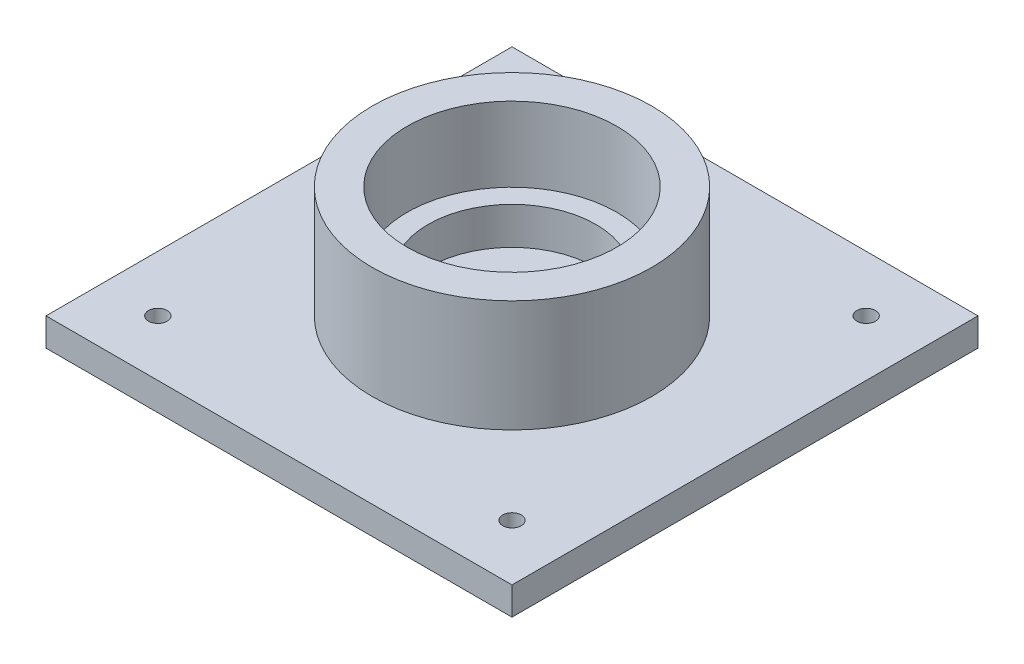
ISO-10303-21;
HEADER;
FILE_DESCRIPTION(('STEP AP214'),'2;1');
FILE_NAME('part.step','',(''),(''),'','','');
FILE_SCHEMA(('AUTOMOTIVE_DESIGN { 1 0 10303 214 1 1 1 1 }'));
ENDSEC;
DATA;
#1=APPLICATION_CONTEXT('core data for automotive mechanical design processes');
#2=APPLICATION_PROTOCOL_DEFINITION('international standard','automotive_design',2000,#1);
#3=PRODUCT_CONTEXT('',#1,'mechanical');
#4=PRODUCT('Part','Part','',(#3));
#5=PRODUCT_RELATED_PRODUCT_CATEGORY('part','',(#4));
#6=PRODUCT_DEFINITION_FORMATION('','',#4);
#7=PRODUCT_DEFINITION_CONTEXT('part definition',#1,'design');
#8=PRODUCT_DEFINITION('design','',#6,#7);
#9=PRODUCT_DEFINITION_SHAPE('','',#8);
#10=(LENGTH_UNIT() NAMED_UNIT(*) SI_UNIT(.MILLI.,.METRE.));
#11=(NAMED_UNIT(*) PLANE_ANGLE_UNIT() SI_UNIT($,.RADIAN.));
#12=(NAMED_UNIT(*) SI_UNIT($,.STERADIAN.) SOLID_ANGLE_UNIT());
#13=UNCERTAINTY_MEASURE_WITH_UNIT(LENGTH_MEASURE(1.E-05),#10,'distance_accuracy_value','');
#14=(GEOMETRIC_REPRESENTATION_CONTEXT(3) GLOBAL_UNCERTAINTY_ASSIGNED_CONTEXT((#13)) GLOBAL_UNIT_ASSIGNED_CONTEXT((#10,
#11,#12)) REPRESENTATION_CONTEXT('',''));
#15=CARTESIAN_POINT('',(0.,0.,0.));
#16=DIRECTION('',(0.,0.,1.));
#17=DIRECTION('',(1.,0.,0.));
#18=AXIS2_PLACEMENT_3D('',#15,#16,#17);
#19=CARTESIAN_POINT('',(0.,15.,0.));
#20=DIRECTION('',(0.,1.,0.));
#21=DIRECTION('',(0.,0.,1.));
#22=AXIS2_PLACEMENT_3D('',#19,#20,#21);
#23=PLANE('',#22);
#24=CARTESIAN_POINT('',(0.,15.,0.));
#25=DIRECTION('',(0.,1.,0.));
#26=DIRECTION('',(0.,0.,1.));
#27=AXIS2_PLACEMENT_3D('',#24,#25,#26);
#28=CIRCLE('',#27,11.25);
#29=CARTESIAN_POINT('',(0.,15.,11.25));
#30=VERTEX_POINT('',#29);
#31=EDGE_CURVE('E130',#30,#30,#28,.T.);
#32=ORIENTED_EDGE('',*,*,#31,.F.);
#33=EDGE_LOOP('',(#32));
#34=FACE_BOUND('',#33,.T.);
#35=CARTESIAN_POINT('',(0.,15.,0.));
#36=DIRECTION('',(0.,1.,0.));
#37=DIRECTION('',(0.,0.,1.));
#38=AXIS2_PLACEMENT_3D('',#35,#36,#37);
#39=CIRCLE('',#38,15.);
#40=CARTESIAN_POINT('',(0.,15.,15.));
#41=VERTEX_POINT('',#40);
#42=EDGE_CURVE('E106',#41,#41,#39,.T.);
#43=ORIENTED_EDGE('',*,*,#42,.T.);
#44=EDGE_LOOP('',(#43));
#45=FACE_BOUND('',#44,.T.);
#46=ADVANCED_FACE('F47',(#34,#45),#23,.T.);
#47=CARTESIAN_POINT('',(0.,7.,0.));
#48=DIRECTION('',(0.,1.,0.));
#49=DIRECTION('',(0.,0.,1.));
#50=AXIS2_PLACEMENT_3D('',#47,#48,#49);
#51=CYLINDRICAL_SURFACE('',#50,11.25);
#52=CARTESIAN_POINT('',(0.,7.,0.));
#53=DIRECTION('',(0.,1.,0.));
#54=DIRECTION('',(0.,0.,1.));
#55=AXIS2_PLACEMENT_3D('',#52,#53,#54);
#56=CIRCLE('',#55,11.25);
#57=CARTESIAN_POINT('',(0.,7.,11.25));
#58=VERTEX_POINT('',#57);
#59=EDGE_CURVE('E129',#58,#58,#56,.T.);
#60=ORIENTED_EDGE('',*,*,#59,.F.);
#61=EDGE_LOOP('',(#60));
#62=FACE_BOUND('',#61,.T.);
#63=ORIENTED_EDGE('',*,*,#31,.T.);
#64=EDGE_LOOP('',(#63));
#65=FACE_BOUND('',#64,.T.);
#66=ADVANCED_FACE('F207',(#62,#65),#51,.F.);
#67=CARTESIAN_POINT('',(0.,7.,0.));
#68=DIRECTION('',(0.,1.,0.));
#69=DIRECTION('',(0.,0.,1.));
#70=AXIS2_PLACEMENT_3D('',#67,#68,#69);
#71=PLANE('',#70);
#72=CARTESIAN_POINT('',(0.,7.,0.));
#73=DIRECTION('',(0.,1.,0.));
#74=DIRECTION('',(0.,0.,1.));
#75=AXIS2_PLACEMENT_3D('',#72,#73,#74);
#76=CIRCLE('',#75,9.);
#77=CARTESIAN_POINT('',(0.,7.,9.));
#78=VERTEX_POINT('',#77);
#79=EDGE_CURVE('E138',#78,#78,#76,.T.);
#80=ORIENTED_EDGE('',*,*,#79,.F.);
#81=EDGE_LOOP('',(#80));
#82=FACE_BOUND('',#81,.T.);
#83=ORIENTED_EDGE('',*,*,#59,.T.);
#84=EDGE_LOOP('',(#83));
#85=FACE_BOUND('',#84,.T.);
#86=ADVANCED_FACE('F215',(#82,#85),#71,.T.);
#87=CARTESIAN_POINT('',(0.,3.,0.));
#88=DIRECTION('',(0.,1.,0.));
#89=DIRECTION('',(0.,0.,1.));
#90=AXIS2_PLACEMENT_3D('',#87,#88,#89);
#91=CYLINDRICAL_SURFACE('',#90,9.);
#92=CARTESIAN_POINT('',(0.,3.,0.));
#93=DIRECTION('',(0.,1.,0.));
#94=DIRECTION('',(0.,0.,1.));
#95=AXIS2_PLACEMENT_3D('',#92,#93,#94);
#96=CIRCLE('',#95,9.);
#97=CARTESIAN_POINT('',(0.,3.,9.));
#98=VERTEX_POINT('',#97);
#99=EDGE_CURVE('E134',#98,#98,#96,.T.);
#100=ORIENTED_EDGE('',*,*,#99,.F.);
#101=EDGE_LOOP('',(#100));
#102=FACE_BOUND('',#101,.T.);
#103=ORIENTED_EDGE('',*,*,#79,.T.);
#104=EDGE_LOOP('',(#103));
#105=FACE_BOUND('',#104,.T.);
#106=ADVANCED_FACE('F289',(#102,#105),#91,.F.);
#107=CARTESIAN_POINT('',(0.,3.,0.));
#108=DIRECTION('',(0.,1.,0.));
#109=DIRECTION('',(0.,0.,1.));
#110=AXIS2_PLACEMENT_3D('',#107,#108,#109);
#111=PLANE('',#110);
#112=ORIENTED_EDGE('',*,*,#99,.T.);
#113=EDGE_LOOP('',(#112));
#114=FACE_BOUND('',#113,.T.);
#115=ADVANCED_FACE('F286',(#114),#111,.T.);
#116=CARTESIAN_POINT('',(0.,-70.7106781186548,0.));
#117=DIRECTION('',(0.,1.,0.));
#118=DIRECTION('',(0.,0.,1.));
#119=AXIS2_PLACEMENT_3D('',#116,#117,#118);
#120=CYLINDRICAL_SURFACE('',#119,15.);
#121=CARTESIAN_POINT('',(0.,3.,0.));
#122=DIRECTION('',(0.,1.,0.));
#123=DIRECTION('',(0.,0.,1.));
#124=AXIS2_PLACEMENT_3D('',#121,#122,#123);
#125=CIRCLE('',#124,15.);
#126=CARTESIAN_POINT('',(0.,3.,15.));
#127=VERTEX_POINT('',#126);
#128=EDGE_CURVE('E96',#127,#127,#125,.F.);
#129=ORIENTED_EDGE('',*,*,#128,.F.);
#130=EDGE_LOOP('',(#129));
#131=FACE_BOUND('',#130,.T.);
#132=ORIENTED_EDGE('',*,*,#42,.F.);
#133=EDGE_LOOP('',(#132));
#134=FACE_BOUND('',#133,.T.);
#135=ADVANCED_FACE('F245',(#131,#134),#120,.T.);
#136=CARTESIAN_POINT('',(0.,3.,0.));
#137=DIRECTION('',(0.,1.,0.));
#138=DIRECTION('',(0.,0.,1.));
#139=AXIS2_PLACEMENT_3D('',#136,#137,#138);
#140=PLANE('',#139);
#141=CARTESIAN_POINT('',(-19.,3.,19.));
#142=DIRECTION('',(0.,1.,0.));
#143=DIRECTION('',(0.,0.,1.));
#144=AXIS2_PLACEMENT_3D('',#141,#142,#143);
#145=CIRCLE('',#144,0.999999999999998);
#146=CARTESIAN_POINT('',(-19.,3.,20.));
#147=VERTEX_POINT('',#146);
#148=EDGE_CURVE('E151',#147,#147,#145,.T.);
#149=ORIENTED_EDGE('',*,*,#148,.F.);
#150=EDGE_LOOP('',(#149));
#151=FACE_BOUND('',#150,.T.);
#152=CARTESIAN_POINT('',(19.,3.,19.));
#153=DIRECTION('',(0.,1.,0.));
#154=DIRECTION('',(0.,0.,1.));
#155=AXIS2_PLACEMENT_3D('',#152,#153,#154);
#156=CIRCLE('',#155,0.999999999999998);
#157=CARTESIAN_POINT('',(19.,3.,20.));
#158=VERTEX_POINT('',#157);
#159=EDGE_CURVE('E159',#158,#158,#156,.T.);
#160=ORIENTED_EDGE('',*,*,#159,.F.);
#161=EDGE_LOOP('',(#160));
#162=FACE_BOUND('',#161,.T.);
#163=CARTESIAN_POINT('',(19.,3.,-19.));
#164=DIRECTION('',(0.,1.,0.));
#165=DIRECTION('',(0.,0.,1.));
#166=AXIS2_PLACEMENT_3D('',#163,#164,#165);
#167=CIRCLE('',#166,0.999999999999998);
#168=CARTESIAN_POINT('',(19.,3.,-18.));
#169=VERTEX_POINT('',#168);
#170=EDGE_CURVE('E163',#169,#169,#167,.T.);
#171=ORIENTED_EDGE('',*,*,#170,.F.);
#172=EDGE_LOOP('',(#171));
#173=FACE_BOUND('',#172,.T.);
#174=CARTESIAN_POINT('',(-19.,3.,-19.));
#175=DIRECTION('',(0.,1.,0.));
#176=DIRECTION('',(0.,0.,1.));
#177=AXIS2_PLACEMENT_3D('',#174,#175,#176);
#178=CIRCLE('',#177,0.999999999999998);
#179=CARTESIAN_POINT('',(-19.,3.,-18.));
#180=VERTEX_POINT('',#179);
#181=EDGE_CURVE('E167',#180,#180,#178,.T.);
#182=ORIENTED_EDGE('',*,*,#181,.F.);
#183=EDGE_LOOP('',(#182));
#184=FACE_BOUND('',#183,.T.);
#185=DIRECTION('',(0.,0.,-1.));
#186=VECTOR('',#185,1.);
#187=CARTESIAN_POINT('',(-25.,3.,-25.));
#188=LINE('',#187,#186);
#189=CARTESIAN_POINT('',(-25.,3.,25.));
#190=VERTEX_POINT('',#189);
#191=CARTESIAN_POINT('',(-25.,3.,-25.));
#192=VERTEX_POINT('',#191);
#193=EDGE_CURVE('E91',#190,#192,#188,.T.);
#194=ORIENTED_EDGE('',*,*,#193,.F.);
#195=DIRECTION('',(-1.,0.,0.));
#196=VECTOR('',#195,1.);
#197=CARTESIAN_POINT('',(-25.,3.,25.));
#198=LINE('',#197,#196);
#199=CARTESIAN_POINT('',(25.,3.,25.));
#200=VERTEX_POINT('',#199);
#201=EDGE_CURVE('E88',#200,#190,#198,.T.);
#202=ORIENTED_EDGE('',*,*,#201,.F.);
#203=DIRECTION('',(0.,0.,1.));
#204=VECTOR('',#203,1.);
#205=CARTESIAN_POINT('',(25.,3.,25.));
#206=LINE('',#205,#204);
#207=CARTESIAN_POINT('',(25.,3.,-25.));
#208=VERTEX_POINT('',#207);
#209=EDGE_CURVE('E63',#208,#200,#206,.T.);
#210=ORIENTED_EDGE('',*,*,#209,.F.);
#211=DIRECTION('',(1.,0.,0.));
#212=VECTOR('',#211,1.);
#213=CARTESIAN_POINT('',(25.,3.,-25.));
#214=LINE('',#213,#212);
#215=EDGE_CURVE('E105',#192,#208,#214,.T.);
#216=ORIENTED_EDGE('',*,*,#215,.F.);
#217=EDGE_LOOP('',(#194,#202,#210,#216));
#218=FACE_BOUND('',#217,.T.);
#219=ORIENTED_EDGE('',*,*,#128,.T.);
#220=EDGE_LOOP('',(#219));
#221=FACE_BOUND('',#220,.T.);
#222=ADVANCED_FACE('F89',(#151,#162,#173,#184,#218,#221),#140,.T.);
#223=CARTESIAN_POINT('',(0.,0.,0.));
#224=DIRECTION('',(0.,1.,0.));
#225=DIRECTION('',(0.,0.,1.));
#226=AXIS2_PLACEMENT_3D('',#223,#224,#225);
#227=PLANE('',#226);
#228=CARTESIAN_POINT('',(-19.,0.,19.));
#229=DIRECTION('',(0.,1.,0.));
#230=DIRECTION('',(0.,0.,1.));
#231=AXIS2_PLACEMENT_3D('',#228,#229,#230);
#232=CIRCLE('',#231,0.999999999999998);
#233=CARTESIAN_POINT('',(-19.,0.,20.));
#234=VERTEX_POINT('',#233);
#235=EDGE_CURVE('E176',#234,#234,#232,.T.);
#236=ORIENTED_EDGE('',*,*,#235,.T.);
#237=EDGE_LOOP('',(#236));
#238=FACE_BOUND('',#237,.T.);
#239=CARTESIAN_POINT('',(19.,0.,19.));
#240=DIRECTION('',(0.,1.,0.));
#241=DIRECTION('',(0.,0.,1.));
#242=AXIS2_PLACEMENT_3D('',#239,#240,#241);
#243=CIRCLE('',#242,0.999999999999998);
#244=CARTESIAN_POINT('',(19.,0.,20.));
#245=VERTEX_POINT('',#244);
#246=EDGE_CURVE('E180',#245,#245,#243,.T.);
#247=ORIENTED_EDGE('',*,*,#246,.T.);
#248=EDGE_LOOP('',(#247));
#249=FACE_BOUND('',#248,.T.);
#250=CARTESIAN_POINT('',(19.,0.,-19.));
#251=DIRECTION('',(0.,1.,0.));
#252=DIRECTION('',(0.,0.,1.));
#253=AXIS2_PLACEMENT_3D('',#250,#251,#252);
#254=CIRCLE('',#253,0.999999999999998);
#255=CARTESIAN_POINT('',(19.,0.,-18.));
#256=VERTEX_POINT('',#255);
#257=EDGE_CURVE('E175',#256,#256,#254,.T.);
#258=ORIENTED_EDGE('',*,*,#257,.T.);
#259=EDGE_LOOP('',(#258));
#260=FACE_BOUND('',#259,.T.);
#261=CARTESIAN_POINT('',(-19.,0.,-19.));
#262=DIRECTION('',(0.,1.,0.));
#263=DIRECTION('',(0.,0.,1.));
#264=AXIS2_PLACEMENT_3D('',#261,#262,#263);
#265=CIRCLE('',#264,0.999999999999998);
#266=CARTESIAN_POINT('',(-19.,0.,-18.));
#267=VERTEX_POINT('',#266);
#268=EDGE_CURVE('E171',#267,#267,#265,.T.);
#269=ORIENTED_EDGE('',*,*,#268,.T.);
#270=EDGE_LOOP('',(#269));
#271=FACE_BOUND('',#270,.T.);
#272=DIRECTION('',(0.,0.,1.));
#273=VECTOR('',#272,1.);
#274=CARTESIAN_POINT('',(-25.,0.,-25.));
#275=LINE('',#274,#273);
#276=CARTESIAN_POINT('',(-25.,0.,-25.));
#277=VERTEX_POINT('',#276);
#278=CARTESIAN_POINT('',(-25.,0.,25.));
#279=VERTEX_POINT('',#278);
#280=EDGE_CURVE('E126',#277,#279,#275,.T.);
#281=ORIENTED_EDGE('',*,*,#280,.F.);
#282=DIRECTION('',(-1.,0.,0.));
#283=VECTOR('',#282,1.);
#284=CARTESIAN_POINT('',(-25.,0.,-25.));
#285=LINE('',#284,#283);
#286=CARTESIAN_POINT('',(25.,0.,-25.));
#287=VERTEX_POINT('',#286);
#288=EDGE_CURVE('E118',#287,#277,#285,.T.);
#289=ORIENTED_EDGE('',*,*,#288,.F.);
#290=DIRECTION('',(0.,0.,-1.));
#291=VECTOR('',#290,1.);
#292=CARTESIAN_POINT('',(25.,0.,-25.));
#293=LINE('',#292,#291);
#294=CARTESIAN_POINT('',(25.,0.,25.));
#295=VERTEX_POINT('',#294);
#296=EDGE_CURVE('E121',#295,#287,#293,.T.);
#297=ORIENTED_EDGE('',*,*,#296,.F.);
#298=DIRECTION('',(1.,0.,0.));
#299=VECTOR('',#298,1.);
#300=CARTESIAN_POINT('',(-25.,0.,25.));
#301=LINE('',#300,#299);
#302=EDGE_CURVE('E110',#279,#295,#301,.T.);
#303=ORIENTED_EDGE('',*,*,#302,.F.);
#304=EDGE_LOOP('',(#281,#289,#297,#303));
#305=FACE_BOUND('',#304,.T.);
#306=ADVANCED_FACE('F188',(#238,#249,#260,#271,#305),#227,.F.);
#307=CARTESIAN_POINT('',(-25.,15.,-25.));
#308=DIRECTION('',(0.,0.,1.));
#309=DIRECTION('',(1.,0.,0.));
#310=AXIS2_PLACEMENT_3D('',#307,#308,#309);
#311=PLANE('',#310);
#312=ORIENTED_EDGE('',*,*,#215,.T.);
#313=DIRECTION('',(0.,-1.,0.));
#314=VECTOR('',#313,1.);
#315=CARTESIAN_POINT('',(25.,15.,-25.));
#316=LINE('',#315,#314);
#317=EDGE_CURVE('E103',#208,#287,#316,.T.);
#318=ORIENTED_EDGE('',*,*,#317,.T.);
#319=ORIENTED_EDGE('',*,*,#288,.T.);
#320=DIRECTION('',(0.,-1.,0.));
#321=VECTOR('',#320,1.);
#322=CARTESIAN_POINT('',(-25.,15.,-25.));
#323=LINE('',#322,#321);
#324=EDGE_CURVE('E71',#192,#277,#323,.T.);
#325=ORIENTED_EDGE('',*,*,#324,.F.);
#326=EDGE_LOOP('',(#312,#318,#319,#325));
#327=FACE_BOUND('',#326,.T.);
#328=ADVANCED_FACE('F224',(#327),#311,.F.);
#329=CARTESIAN_POINT('',(25.,15.,-25.));
#330=DIRECTION('',(-1.,0.,0.));
#331=DIRECTION('',(0.,0.,1.));
#332=AXIS2_PLACEMENT_3D('',#329,#330,#331);
#333=PLANE('',#332);
#334=ORIENTED_EDGE('',*,*,#209,.T.);
#335=DIRECTION('',(0.,-1.,0.));
#336=VECTOR('',#335,1.);
#337=CARTESIAN_POINT('',(25.,15.,25.));
#338=LINE('',#337,#336);
#339=EDGE_CURVE('E56',#200,#295,#338,.T.);
#340=ORIENTED_EDGE('',*,*,#339,.T.);
#341=ORIENTED_EDGE('',*,*,#296,.T.);
#342=ORIENTED_EDGE('',*,*,#317,.F.);
#343=EDGE_LOOP('',(#334,#340,#341,#342));
#344=FACE_BOUND('',#343,.T.);
#345=ADVANCED_FACE('F100',(#344),#333,.F.);
#346=CARTESIAN_POINT('',(-25.,15.,25.));
#347=DIRECTION('',(0.,0.,-1.));
#348=DIRECTION('',(-1.,0.,0.));
#349=AXIS2_PLACEMENT_3D('',#346,#347,#348);
#350=PLANE('',#349);
#351=ORIENTED_EDGE('',*,*,#201,.T.);
#352=DIRECTION('',(0.,-1.,0.));
#353=VECTOR('',#352,1.);
#354=CARTESIAN_POINT('',(-25.,15.,25.));
#355=LINE('',#354,#353);
#356=EDGE_CURVE('E12',#190,#279,#355,.T.);
#357=ORIENTED_EDGE('',*,*,#356,.T.);
#358=ORIENTED_EDGE('',*,*,#302,.T.);
#359=ORIENTED_EDGE('',*,*,#339,.F.);
#360=EDGE_LOOP('',(#351,#357,#358,#359));
#361=FACE_BOUND('',#360,.T.);
#362=ADVANCED_FACE('F108',(#361),#350,.F.);
#363=CARTESIAN_POINT('',(-25.,15.,-25.));
#364=DIRECTION('',(1.,0.,0.));
#365=DIRECTION('',(0.,0.,-1.));
#366=AXIS2_PLACEMENT_3D('',#363,#364,#365);
#367=PLANE('',#366);
#368=ORIENTED_EDGE('',*,*,#193,.T.);
#369=ORIENTED_EDGE('',*,*,#324,.T.);
#370=ORIENTED_EDGE('',*,*,#280,.T.);
#371=ORIENTED_EDGE('',*,*,#356,.F.);
#372=EDGE_LOOP('',(#368,#369,#370,#371));
#373=FACE_BOUND('',#372,.T.);
#374=ADVANCED_FACE('F49',(#373),#367,.F.);
#375=CARTESIAN_POINT('',(-19.,0.,-19.));
#376=DIRECTION('',(0.,1.,0.));
#377=DIRECTION('',(0.,0.,1.));
#378=AXIS2_PLACEMENT_3D('',#375,#376,#377);
#379=CYLINDRICAL_SURFACE('',#378,0.999999999999998);
#380=ORIENTED_EDGE('',*,*,#181,.T.);
#381=EDGE_LOOP('',(#380));
#382=FACE_BOUND('',#381,.T.);
#383=ORIENTED_EDGE('',*,*,#268,.F.);
#384=EDGE_LOOP('',(#383));
#385=FACE_BOUND('',#384,.T.);
#386=ADVANCED_FACE('F194',(#382,#385),#379,.F.);
#387=CARTESIAN_POINT('',(19.,0.,-19.));
#388=DIRECTION('',(0.,1.,0.));
#389=DIRECTION('',(0.,0.,1.));
#390=AXIS2_PLACEMENT_3D('',#387,#388,#389);
#391=CYLINDRICAL_SURFACE('',#390,0.999999999999998);
#392=ORIENTED_EDGE('',*,*,#170,.T.);
#393=EDGE_LOOP('',(#392));
#394=FACE_BOUND('',#393,.T.);
#395=ORIENTED_EDGE('',*,*,#257,.F.);
#396=EDGE_LOOP('',(#395));
#397=FACE_BOUND('',#396,.T.);
#398=ADVANCED_FACE('F191',(#394,#397),#391,.F.);
#399=CARTESIAN_POINT('',(19.,0.,19.));
#400=DIRECTION('',(0.,1.,0.));
#401=DIRECTION('',(0.,0.,1.));
#402=AXIS2_PLACEMENT_3D('',#399,#400,#401);
#403=CYLINDRICAL_SURFACE('',#402,0.999999999999998);
#404=ORIENTED_EDGE('',*,*,#159,.T.);
#405=EDGE_LOOP('',(#404));
#406=FACE_BOUND('',#405,.T.);
#407=ORIENTED_EDGE('',*,*,#246,.F.);
#408=EDGE_LOOP('',(#407));
#409=FACE_BOUND('',#408,.T.);
#410=ADVANCED_FACE('F193',(#406,#409),#403,.F.);
#411=CARTESIAN_POINT('',(-19.,0.,19.));
#412=DIRECTION('',(0.,1.,0.));
#413=DIRECTION('',(0.,0.,1.));
#414=AXIS2_PLACEMENT_3D('',#411,#412,#413);
#415=CYLINDRICAL_SURFACE('',#414,0.999999999999998);
#416=ORIENTED_EDGE('',*,*,#148,.T.);
#417=EDGE_LOOP('',(#416));
#418=FACE_BOUND('',#417,.T.);
#419=ORIENTED_EDGE('',*,*,#235,.F.);
#420=EDGE_LOOP('',(#419));
#421=FACE_BOUND('',#420,.T.);
#422=ADVANCED_FACE('F201',(#418,#421),#415,.F.);
#423=CLOSED_SHELL('',(#46,#66,#86,#106,#115,#135,#222,#306,#328,#345,#362,#374,#386,#398,#410,#422));
#424=MANIFOLD_SOLID_BREP('B2',#423);
#425=ADVANCED_BREP_SHAPE_REPRESENTATION('',(#18,#424),#14);
#426=SHAPE_DEFINITION_REPRESENTATION(#9,#425);
ENDSEC;
END-ISO-10303-21;
